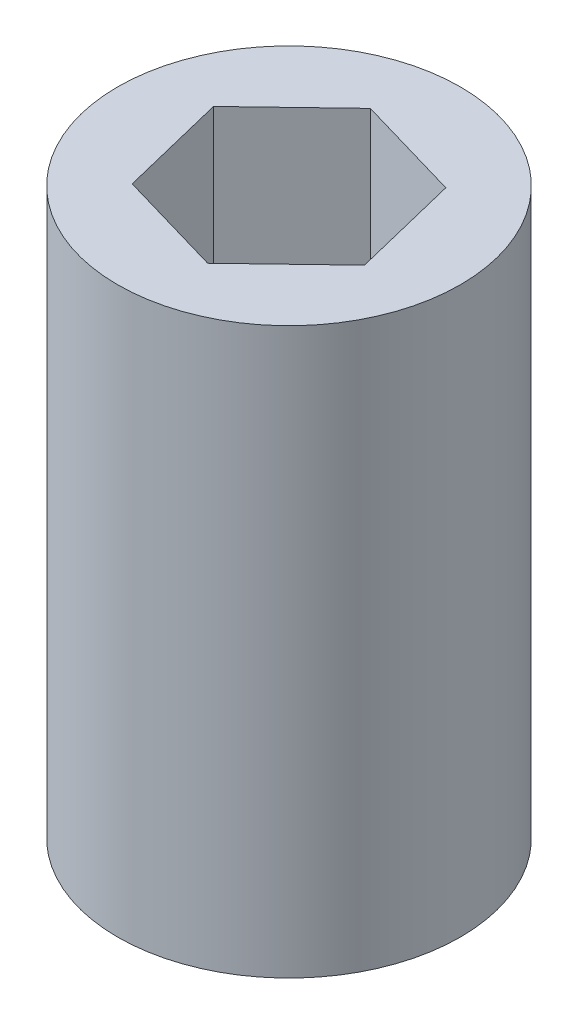
ISO-10303-21;
HEADER;
FILE_DESCRIPTION(('STEP AP214'),'2;1');
FILE_NAME('part.step','',(''),(''),'','','');
FILE_SCHEMA(('AUTOMOTIVE_DESIGN { 1 0 10303 214 1 1 1 1 }'));
ENDSEC;
DATA;
#1=APPLICATION_CONTEXT('core data for automotive mechanical design processes');
#2=APPLICATION_PROTOCOL_DEFINITION('international standard','automotive_design',2000,#1);
#3=PRODUCT_CONTEXT('',#1,'mechanical');
#4=PRODUCT('Part','Part','',(#3));
#5=PRODUCT_RELATED_PRODUCT_CATEGORY('part','',(#4));
#6=PRODUCT_DEFINITION_FORMATION('','',#4);
#7=PRODUCT_DEFINITION_CONTEXT('part definition',#1,'design');
#8=PRODUCT_DEFINITION('design','',#6,#7);
#9=PRODUCT_DEFINITION_SHAPE('','',#8);
#10=(LENGTH_UNIT() NAMED_UNIT(*) SI_UNIT(.MILLI.,.METRE.));
#11=(NAMED_UNIT(*) PLANE_ANGLE_UNIT() SI_UNIT($,.RADIAN.));
#12=(NAMED_UNIT(*) SI_UNIT($,.STERADIAN.) SOLID_ANGLE_UNIT());
#13=UNCERTAINTY_MEASURE_WITH_UNIT(LENGTH_MEASURE(1.E-05),#10,'distance_accuracy_value','');
#14=(GEOMETRIC_REPRESENTATION_CONTEXT(3) GLOBAL_UNCERTAINTY_ASSIGNED_CONTEXT((#13)) GLOBAL_UNIT_ASSIGNED_CONTEXT((#10,
#11,#12)) REPRESENTATION_CONTEXT('',''));
#15=CARTESIAN_POINT('',(0.,0.,0.));
#16=DIRECTION('',(0.,0.,1.));
#17=DIRECTION('',(1.,0.,0.));
#18=AXIS2_PLACEMENT_3D('',#15,#16,#17);
#19=CARTESIAN_POINT('',(0.,15.,0.));
#20=DIRECTION('',(0.,-1.,0.));
#21=DIRECTION('',(0.,0.,-1.));
#22=AXIS2_PLACEMENT_3D('',#19,#20,#21);
#23=CYLINDRICAL_SURFACE('',#22,4.55);
#24=CARTESIAN_POINT('',(0.,15.,0.));
#25=DIRECTION('',(0.,1.,0.));
#26=DIRECTION('',(0.,0.,1.));
#27=AXIS2_PLACEMENT_3D('',#24,#25,#26);
#28=CIRCLE('',#27,4.55);
#29=CARTESIAN_POINT('',(0.,15.,4.55));
#30=VERTEX_POINT('',#29);
#31=EDGE_CURVE('E11',#30,#30,#28,.T.);
#32=ORIENTED_EDGE('',*,*,#31,.F.);
#33=EDGE_LOOP('',(#32));
#34=FACE_BOUND('',#33,.T.);
#35=CARTESIAN_POINT('',(0.,0.,0.));
#36=DIRECTION('',(0.,1.,0.));
#37=DIRECTION('',(0.,0.,1.));
#38=AXIS2_PLACEMENT_3D('',#35,#36,#37);
#39=CIRCLE('',#38,4.55);
#40=CARTESIAN_POINT('',(0.,0.,4.55));
#41=VERTEX_POINT('',#40);
#42=EDGE_CURVE('E36',#41,#41,#39,.T.);
#43=ORIENTED_EDGE('',*,*,#42,.T.);
#44=EDGE_LOOP('',(#43));
#45=FACE_BOUND('',#44,.T.);
#46=ADVANCED_FACE('F33',(#34,#45),#23,.T.);
#47=CARTESIAN_POINT('',(0.,15.,0.));
#48=DIRECTION('',(0.,1.,0.));
#49=DIRECTION('',(0.,0.,1.));
#50=AXIS2_PLACEMENT_3D('',#47,#48,#49);
#51=PLANE('',#50);
#52=DIRECTION('',(0.237991419769063,0.,0.971267256792025));
#53=VECTOR('',#52,1.);
#54=CARTESIAN_POINT('',(-2.82711275100431,15.,-0.82306348060695));
#55=LINE('',#54,#53);
#56=CARTESIAN_POINT('',(-2.82711275100431,15.,-0.82306348060695));
#57=VERTEX_POINT('',#56);
#58=CARTESIAN_POINT('',(-2.12635025863502,15.,2.03681972142917));
#59=VERTEX_POINT('',#58);
#60=EDGE_CURVE('E47',#57,#59,#55,.T.);
#61=ORIENTED_EDGE('',*,*,#60,.F.);
#62=DIRECTION('',(-0.722146408361386,0.,0.691740243798747));
#63=VECTOR('',#62,1.);
#64=CARTESIAN_POINT('',(-0.700762492369296,15.,-2.85988320203612));
#65=LINE('',#64,#63);
#66=CARTESIAN_POINT('',(-0.700762492369296,15.,-2.85988320203612));
#67=VERTEX_POINT('',#66);
#68=EDGE_CURVE('E104',#67,#57,#65,.T.);
#69=ORIENTED_EDGE('',*,*,#68,.F.);
#70=DIRECTION('',(-0.960137828130449,0.,-0.279527012993278));
#71=VECTOR('',#70,1.);
#72=CARTESIAN_POINT('',(2.12635025863501,15.,-2.03681972142917));
#73=LINE('',#72,#71);
#74=CARTESIAN_POINT('',(2.12635025863501,15.,-2.03681972142917));
#75=VERTEX_POINT('',#74);
#76=EDGE_CURVE('E107',#75,#67,#73,.T.);
#77=ORIENTED_EDGE('',*,*,#76,.F.);
#78=DIRECTION('',(-0.237991419769063,0.,-0.971267256792025));
#79=VECTOR('',#78,1.);
#80=CARTESIAN_POINT('',(2.82711275100431,15.,0.823063480606951));
#81=LINE('',#80,#79);
#82=CARTESIAN_POINT('',(2.82711275100431,15.,0.823063480606951));
#83=VERTEX_POINT('',#82);
#84=EDGE_CURVE('E123',#83,#75,#81,.T.);
#85=ORIENTED_EDGE('',*,*,#84,.F.);
#86=DIRECTION('',(0.722146408361386,0.,-0.691740243798747));
#87=VECTOR('',#86,1.);
#88=CARTESIAN_POINT('',(0.700762492369297,15.,2.85988320203612));
#89=LINE('',#88,#87);
#90=CARTESIAN_POINT('',(0.700762492369297,15.,2.85988320203612));
#91=VERTEX_POINT('',#90);
#92=EDGE_CURVE('E120',#91,#83,#89,.T.);
#93=ORIENTED_EDGE('',*,*,#92,.F.);
#94=DIRECTION('',(0.960137828130449,0.,0.279527012993278));
#95=VECTOR('',#94,1.);
#96=CARTESIAN_POINT('',(-2.12635025863502,15.,2.03681972142917));
#97=LINE('',#96,#95);
#98=EDGE_CURVE('E118',#59,#91,#97,.T.);
#99=ORIENTED_EDGE('',*,*,#98,.F.);
#100=EDGE_LOOP('',(#61,#69,#77,#85,#93,#99));
#101=FACE_BOUND('',#100,.T.);
#102=ORIENTED_EDGE('',*,*,#31,.T.);
#103=EDGE_LOOP('',(#102));
#104=FACE_BOUND('',#103,.T.);
#105=ADVANCED_FACE('F140',(#101,#104),#51,.T.);
#106=CARTESIAN_POINT('',(0.,0.,0.));
#107=DIRECTION('',(0.,1.,0.));
#108=DIRECTION('',(0.,0.,1.));
#109=AXIS2_PLACEMENT_3D('',#106,#107,#108);
#110=PLANE('',#109);
#111=DIRECTION('',(-0.722146408361386,0.,0.691740243798747));
#112=VECTOR('',#111,1.);
#113=CARTESIAN_POINT('',(-0.700762492369296,0.,-2.85988320203612));
#114=LINE('',#113,#112);
#115=CARTESIAN_POINT('',(-0.700762492369296,0.,-2.85988320203612));
#116=VERTEX_POINT('',#115);
#117=CARTESIAN_POINT('',(-2.82711275100431,0.,-0.82306348060695));
#118=VERTEX_POINT('',#117);
#119=EDGE_CURVE('E93',#116,#118,#114,.T.);
#120=ORIENTED_EDGE('',*,*,#119,.T.);
#121=DIRECTION('',(0.237991419769063,0.,0.971267256792025));
#122=VECTOR('',#121,1.);
#123=CARTESIAN_POINT('',(-2.82711275100431,0.,-0.82306348060695));
#124=LINE('',#123,#122);
#125=CARTESIAN_POINT('',(-2.12635025863502,0.,2.03681972142917));
#126=VERTEX_POINT('',#125);
#127=EDGE_CURVE('E87',#118,#126,#124,.T.);
#128=ORIENTED_EDGE('',*,*,#127,.T.);
#129=DIRECTION('',(0.960137828130449,0.,0.279527012993278));
#130=VECTOR('',#129,1.);
#131=CARTESIAN_POINT('',(-2.12635025863502,0.,2.03681972142917));
#132=LINE('',#131,#130);
#133=CARTESIAN_POINT('',(0.700762492369297,0.,2.85988320203612));
#134=VERTEX_POINT('',#133);
#135=EDGE_CURVE('E96',#126,#134,#132,.T.);
#136=ORIENTED_EDGE('',*,*,#135,.T.);
#137=DIRECTION('',(0.722146408361386,0.,-0.691740243798747));
#138=VECTOR('',#137,1.);
#139=CARTESIAN_POINT('',(0.700762492369297,0.,2.85988320203612));
#140=LINE('',#139,#138);
#141=CARTESIAN_POINT('',(2.82711275100431,0.,0.823063480606951));
#142=VERTEX_POINT('',#141);
#143=EDGE_CURVE('E55',#134,#142,#140,.T.);
#144=ORIENTED_EDGE('',*,*,#143,.T.);
#145=DIRECTION('',(-0.237991419769063,0.,-0.971267256792025));
#146=VECTOR('',#145,1.);
#147=CARTESIAN_POINT('',(2.82711275100431,0.,0.823063480606951));
#148=LINE('',#147,#146);
#149=CARTESIAN_POINT('',(2.12635025863501,0.,-2.03681972142917));
#150=VERTEX_POINT('',#149);
#151=EDGE_CURVE('E111',#142,#150,#148,.T.);
#152=ORIENTED_EDGE('',*,*,#151,.T.);
#153=DIRECTION('',(-0.960137828130449,0.,-0.279527012993278));
#154=VECTOR('',#153,1.);
#155=CARTESIAN_POINT('',(2.12635025863501,0.,-2.03681972142917));
#156=LINE('',#155,#154);
#157=EDGE_CURVE('E114',#150,#116,#156,.T.);
#158=ORIENTED_EDGE('',*,*,#157,.T.);
#159=EDGE_LOOP('',(#120,#128,#136,#144,#152,#158));
#160=FACE_BOUND('',#159,.T.);
#161=ORIENTED_EDGE('',*,*,#42,.F.);
#162=EDGE_LOOP('',(#161));
#163=FACE_BOUND('',#162,.T.);
#164=ADVANCED_FACE('F100',(#160,#163),#110,.F.);
#165=CARTESIAN_POINT('',(-2.82711275100431,0.,-0.82306348060695));
#166=DIRECTION('',(-0.971267256792025,0.,0.237991419769063));
#167=DIRECTION('',(0.237991419769063,0.,0.971267256792025));
#168=AXIS2_PLACEMENT_3D('',#165,#166,#167);
#169=PLANE('',#168);
#170=ORIENTED_EDGE('',*,*,#60,.T.);
#171=DIRECTION('',(0.,1.,0.));
#172=VECTOR('',#171,1.);
#173=CARTESIAN_POINT('',(-2.12635025863502,0.,2.03681972142917));
#174=LINE('',#173,#172);
#175=EDGE_CURVE('E83',#126,#59,#174,.T.);
#176=ORIENTED_EDGE('',*,*,#175,.F.);
#177=ORIENTED_EDGE('',*,*,#127,.F.);
#178=DIRECTION('',(0.,1.,0.));
#179=VECTOR('',#178,1.);
#180=CARTESIAN_POINT('',(-2.82711275100431,0.,-0.82306348060695));
#181=LINE('',#180,#179);
#182=EDGE_CURVE('E128',#118,#57,#181,.T.);
#183=ORIENTED_EDGE('',*,*,#182,.T.);
#184=EDGE_LOOP('',(#170,#176,#177,#183));
#185=FACE_BOUND('',#184,.T.);
#186=ADVANCED_FACE('F85',(#185),#169,.F.);
#187=CARTESIAN_POINT('',(-0.700762492369296,0.,-2.85988320203612));
#188=DIRECTION('',(-0.691740243798747,0.,-0.722146408361387));
#189=DIRECTION('',(-0.722146408361387,0.,0.691740243798747));
#190=AXIS2_PLACEMENT_3D('',#187,#188,#189);
#191=PLANE('',#190);
#192=ORIENTED_EDGE('',*,*,#68,.T.);
#193=ORIENTED_EDGE('',*,*,#182,.F.);
#194=ORIENTED_EDGE('',*,*,#119,.F.);
#195=DIRECTION('',(0.,1.,0.));
#196=VECTOR('',#195,1.);
#197=CARTESIAN_POINT('',(-0.700762492369296,0.,-2.85988320203612));
#198=LINE('',#197,#196);
#199=EDGE_CURVE('E130',#116,#67,#198,.T.);
#200=ORIENTED_EDGE('',*,*,#199,.T.);
#201=EDGE_LOOP('',(#192,#193,#194,#200));
#202=FACE_BOUND('',#201,.T.);
#203=ADVANCED_FACE('F151',(#202),#191,.F.);
#204=CARTESIAN_POINT('',(2.12635025863501,0.,-2.03681972142917));
#205=DIRECTION('',(0.279527012993278,0.,-0.960137828130449));
#206=DIRECTION('',(-0.960137828130449,0.,-0.279527012993278));
#207=AXIS2_PLACEMENT_3D('',#204,#205,#206);
#208=PLANE('',#207);
#209=ORIENTED_EDGE('',*,*,#76,.T.);
#210=ORIENTED_EDGE('',*,*,#199,.F.);
#211=ORIENTED_EDGE('',*,*,#157,.F.);
#212=DIRECTION('',(0.,1.,0.));
#213=VECTOR('',#212,1.);
#214=CARTESIAN_POINT('',(2.12635025863501,0.,-2.03681972142917));
#215=LINE('',#214,#213);
#216=EDGE_CURVE('E132',#150,#75,#215,.T.);
#217=ORIENTED_EDGE('',*,*,#216,.T.);
#218=EDGE_LOOP('',(#209,#210,#211,#217));
#219=FACE_BOUND('',#218,.T.);
#220=ADVANCED_FACE('F149',(#219),#208,.F.);
#221=CARTESIAN_POINT('',(2.82711275100431,0.,0.823063480606951));
#222=DIRECTION('',(0.971267256792025,0.,-0.237991419769063));
#223=DIRECTION('',(-0.237991419769063,0.,-0.971267256792025));
#224=AXIS2_PLACEMENT_3D('',#221,#222,#223);
#225=PLANE('',#224);
#226=ORIENTED_EDGE('',*,*,#84,.T.);
#227=ORIENTED_EDGE('',*,*,#216,.F.);
#228=ORIENTED_EDGE('',*,*,#151,.F.);
#229=DIRECTION('',(0.,1.,0.));
#230=VECTOR('',#229,1.);
#231=CARTESIAN_POINT('',(2.82711275100431,0.,0.823063480606951));
#232=LINE('',#231,#230);
#233=EDGE_CURVE('E134',#142,#83,#232,.T.);
#234=ORIENTED_EDGE('',*,*,#233,.T.);
#235=EDGE_LOOP('',(#226,#227,#228,#234));
#236=FACE_BOUND('',#235,.T.);
#237=ADVANCED_FACE('F145',(#236),#225,.F.);
#238=CARTESIAN_POINT('',(0.700762492369297,0.,2.85988320203612));
#239=DIRECTION('',(0.691740243798747,0.,0.722146408361386));
#240=DIRECTION('',(0.722146408361386,0.,-0.691740243798747));
#241=AXIS2_PLACEMENT_3D('',#238,#239,#240);
#242=PLANE('',#241);
#243=ORIENTED_EDGE('',*,*,#92,.T.);
#244=ORIENTED_EDGE('',*,*,#233,.F.);
#245=ORIENTED_EDGE('',*,*,#143,.F.);
#246=DIRECTION('',(0.,1.,0.));
#247=VECTOR('',#246,1.);
#248=CARTESIAN_POINT('',(0.700762492369297,0.,2.85988320203612));
#249=LINE('',#248,#247);
#250=EDGE_CURVE('E92',#134,#91,#249,.T.);
#251=ORIENTED_EDGE('',*,*,#250,.T.);
#252=EDGE_LOOP('',(#243,#244,#245,#251));
#253=FACE_BOUND('',#252,.T.);
#254=ADVANCED_FACE('F136',(#253),#242,.F.);
#255=CARTESIAN_POINT('',(-2.12635025863502,0.,2.03681972142917));
#256=DIRECTION('',(-0.279527012993278,0.,0.960137828130449));
#257=DIRECTION('',(0.960137828130449,0.,0.279527012993278));
#258=AXIS2_PLACEMENT_3D('',#255,#256,#257);
#259=PLANE('',#258);
#260=ORIENTED_EDGE('',*,*,#98,.T.);
#261=ORIENTED_EDGE('',*,*,#250,.F.);
#262=ORIENTED_EDGE('',*,*,#135,.F.);
#263=ORIENTED_EDGE('',*,*,#175,.T.);
#264=EDGE_LOOP('',(#260,#261,#262,#263));
#265=FACE_BOUND('',#264,.T.);
#266=ADVANCED_FACE('F97',(#265),#259,.F.);
#267=CLOSED_SHELL('',(#46,#105,#164,#186,#203,#220,#237,#254,#266));
#268=MANIFOLD_SOLID_BREP('B2',#267);
#269=ADVANCED_BREP_SHAPE_REPRESENTATION('',(#18,#268),#14);
#270=SHAPE_DEFINITION_REPRESENTATION(#9,#269);
ENDSEC;
END-ISO-10303-21;
